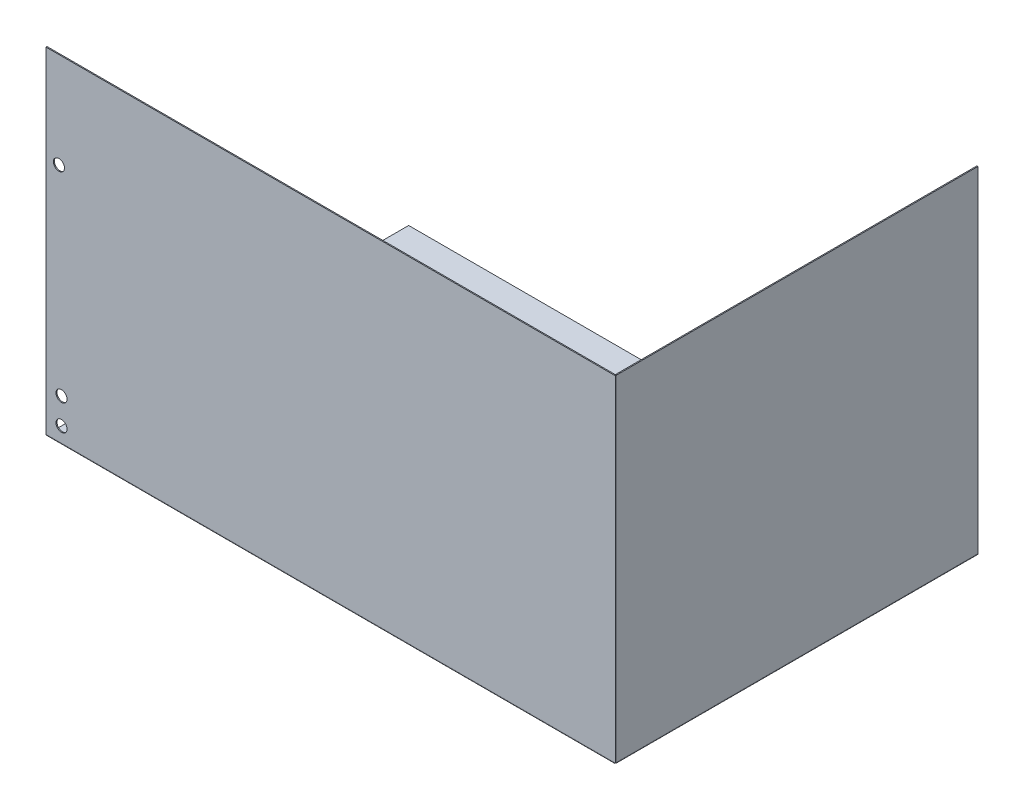
ISO-10303-21;
HEADER;
FILE_DESCRIPTION(('STEP AP214'),'2;1');
FILE_NAME('part.step','',(''),(''),'','','');
FILE_SCHEMA(('AUTOMOTIVE_DESIGN { 1 0 10303 214 1 1 1 1 }'));
ENDSEC;
DATA;
#1=APPLICATION_CONTEXT('core data for automotive mechanical design processes');
#2=APPLICATION_PROTOCOL_DEFINITION('international standard','automotive_design',2000,#1);
#3=PRODUCT_CONTEXT('',#1,'mechanical');
#4=PRODUCT('Part','Part','',(#3));
#5=PRODUCT_RELATED_PRODUCT_CATEGORY('part','',(#4));
#6=PRODUCT_DEFINITION_FORMATION('','',#4);
#7=PRODUCT_DEFINITION_CONTEXT('part definition',#1,'design');
#8=PRODUCT_DEFINITION('design','',#6,#7);
#9=PRODUCT_DEFINITION_SHAPE('','',#8);
#10=(LENGTH_UNIT() NAMED_UNIT(*) SI_UNIT(.MILLI.,.METRE.));
#11=(NAMED_UNIT(*) PLANE_ANGLE_UNIT() SI_UNIT($,.RADIAN.));
#12=(NAMED_UNIT(*) SI_UNIT($,.STERADIAN.) SOLID_ANGLE_UNIT());
#13=UNCERTAINTY_MEASURE_WITH_UNIT(LENGTH_MEASURE(1.E-05),#10,'distance_accuracy_value','');
#14=(GEOMETRIC_REPRESENTATION_CONTEXT(3) GLOBAL_UNCERTAINTY_ASSIGNED_CONTEXT((#13)) GLOBAL_UNIT_ASSIGNED_CONTEXT((#10,
#11,#12)) REPRESENTATION_CONTEXT('',''));
#15=CARTESIAN_POINT('',(0.,0.,0.));
#16=DIRECTION('',(0.,0.,1.));
#17=DIRECTION('',(1.,0.,0.));
#18=AXIS2_PLACEMENT_3D('',#15,#16,#17);
#19=CARTESIAN_POINT('',(0.,-2.00000000000001,-699.));
#20=DIRECTION('',(0.,0.,-1.));
#21=DIRECTION('',(-1.,0.,0.));
#22=AXIS2_PLACEMENT_3D('',#19,#20,#21);
#23=PLANE('',#22);
#24=DIRECTION('',(-1.,0.,0.));
#25=VECTOR('',#24,1.);
#26=CARTESIAN_POINT('',(0.,0.,-699.));
#27=LINE('',#26,#25);
#28=CARTESIAN_POINT('',(1099.,0.,-699.));
#29=VERTEX_POINT('',#28);
#30=CARTESIAN_POINT('',(0.,0.,-699.));
#31=VERTEX_POINT('',#30);
#32=EDGE_CURVE('E127',#29,#31,#27,.T.);
#33=ORIENTED_EDGE('',*,*,#32,.F.);
#34=DIRECTION('',(0.,-1.,0.));
#35=VECTOR('',#34,1.);
#36=CARTESIAN_POINT('',(1099.,0.,-699.));
#37=LINE('',#36,#35);
#38=CARTESIAN_POINT('',(1099.,-2.00000000000001,-699.));
#39=VERTEX_POINT('',#38);
#40=EDGE_CURVE('E842',#29,#39,#37,.T.);
#41=ORIENTED_EDGE('',*,*,#40,.T.);
#42=DIRECTION('',(-1.,0.,0.));
#43=VECTOR('',#42,1.);
#44=CARTESIAN_POINT('',(0.,-2.00000000000001,-699.));
#45=LINE('',#44,#43);
#46=CARTESIAN_POINT('',(0.,-2.00000000000001,-699.));
#47=VERTEX_POINT('',#46);
#48=EDGE_CURVE('E885',#39,#47,#45,.T.);
#49=ORIENTED_EDGE('',*,*,#48,.T.);
#50=DIRECTION('',(0.,1.,0.));
#51=VECTOR('',#50,1.);
#52=CARTESIAN_POINT('',(0.,-2.00000000000001,-699.));
#53=LINE('',#52,#51);
#54=EDGE_CURVE('E888',#47,#31,#53,.T.);
#55=ORIENTED_EDGE('',*,*,#54,.T.);
#56=EDGE_LOOP('',(#33,#41,#49,#55));
#57=FACE_BOUND('',#56,.T.);
#58=ADVANCED_FACE('F100',(#57),#23,.T.);
#59=CARTESIAN_POINT('',(0.,-2.00000000000001,0.));
#60=DIRECTION('',(0.,-1.,0.));
#61=DIRECTION('',(0.,0.,-1.));
#62=AXIS2_PLACEMENT_3D('',#59,#60,#61);
#63=PLANE('',#62);
#64=CARTESIAN_POINT('',(28.,-2.,-349.5));
#65=DIRECTION('',(0.,1.,0.));
#66=DIRECTION('',(0.,0.,1.));
#67=AXIS2_PLACEMENT_3D('',#64,#65,#66);
#68=CIRCLE('',#67,13.5);
#69=CARTESIAN_POINT('',(28.,-2.,-336.));
#70=VERTEX_POINT('',#69);
#71=EDGE_CURVE('E811',#70,#70,#68,.T.);
#72=ORIENTED_EDGE('',*,*,#71,.T.);
#73=EDGE_LOOP('',(#72));
#74=FACE_BOUND('',#73,.T.);
#75=CARTESIAN_POINT('',(1071.,-2.,-349.5));
#76=DIRECTION('',(0.,1.,0.));
#77=DIRECTION('',(0.,0.,-1.));
#78=AXIS2_PLACEMENT_3D('',#75,#76,#77);
#79=CIRCLE('',#78,13.5000000000001);
#80=CARTESIAN_POINT('',(1071.,-2.,-363.));
#81=VERTEX_POINT('',#80);
#82=EDGE_CURVE('E820',#81,#81,#79,.T.);
#83=ORIENTED_EDGE('',*,*,#82,.T.);
#84=EDGE_LOOP('',(#83));
#85=FACE_BOUND('',#84,.T.);
#86=ORIENTED_EDGE('',*,*,#48,.F.);
#87=DIRECTION('',(0.,0.,1.));
#88=VECTOR('',#87,1.);
#89=CARTESIAN_POINT('',(1099.,-2.00000000000001,-699.));
#90=LINE('',#89,#88);
#91=CARTESIAN_POINT('',(1099.,-2.00000000000001,0.));
#92=VERTEX_POINT('',#91);
#93=EDGE_CURVE('E839',#39,#92,#90,.T.);
#94=ORIENTED_EDGE('',*,*,#93,.T.);
#95=DIRECTION('',(1.,0.,0.));
#96=VECTOR('',#95,1.);
#97=CARTESIAN_POINT('',(0.,-2.00000000000001,0.));
#98=LINE('',#97,#96);
#99=CARTESIAN_POINT('',(0.,-2.00000000000001,0.));
#100=VERTEX_POINT('',#99);
#101=EDGE_CURVE('E894',#100,#92,#98,.T.);
#102=ORIENTED_EDGE('',*,*,#101,.F.);
#103=DIRECTION('',(0.,0.,1.));
#104=VECTOR('',#103,1.);
#105=CARTESIAN_POINT('',(0.,-2.00000000000001,0.));
#106=LINE('',#105,#104);
#107=EDGE_CURVE('E881',#47,#100,#106,.T.);
#108=ORIENTED_EDGE('',*,*,#107,.F.);
#109=EDGE_LOOP('',(#86,#94,#102,#108));
#110=FACE_BOUND('',#109,.T.);
#111=ADVANCED_FACE('F451',(#74,#85,#110),#63,.T.);
#112=CARTESIAN_POINT('',(0.,0.,0.));
#113=DIRECTION('',(0.,-1.,0.));
#114=DIRECTION('',(0.,0.,-1.));
#115=AXIS2_PLACEMENT_3D('',#112,#113,#114);
#116=PLANE('',#115);
#117=CARTESIAN_POINT('',(28.,0.,-349.5));
#118=DIRECTION('',(0.,1.,0.));
#119=DIRECTION('',(0.,0.,1.));
#120=AXIS2_PLACEMENT_3D('',#117,#118,#119);
#121=CIRCLE('',#120,13.5);
#122=CARTESIAN_POINT('',(28.,0.,-336.));
#123=VERTEX_POINT('',#122);
#124=EDGE_CURVE('E816',#123,#123,#121,.T.);
#125=ORIENTED_EDGE('',*,*,#124,.F.);
#126=EDGE_LOOP('',(#125));
#127=FACE_BOUND('',#126,.T.);
#128=CARTESIAN_POINT('',(1071.,0.,-349.5));
#129=DIRECTION('',(0.,1.,0.));
#130=DIRECTION('',(0.,0.,-1.));
#131=AXIS2_PLACEMENT_3D('',#128,#129,#130);
#132=CIRCLE('',#131,13.5000000000001);
#133=CARTESIAN_POINT('',(1071.,0.,-363.));
#134=VERTEX_POINT('',#133);
#135=EDGE_CURVE('E794',#134,#134,#132,.T.);
#136=ORIENTED_EDGE('',*,*,#135,.F.);
#137=EDGE_LOOP('',(#136));
#138=FACE_BOUND('',#137,.T.);
#139=DIRECTION('',(0.,0.,1.));
#140=VECTOR('',#139,1.);
#141=CARTESIAN_POINT('',(1099.,0.,-699.));
#142=LINE('',#141,#140);
#143=CARTESIAN_POINT('',(1099.,0.,0.));
#144=VERTEX_POINT('',#143);
#145=EDGE_CURVE('E112',#29,#144,#142,.T.);
#146=ORIENTED_EDGE('',*,*,#145,.F.);
#147=ORIENTED_EDGE('',*,*,#32,.T.);
#148=DIRECTION('',(0.,0.,1.));
#149=VECTOR('',#148,1.);
#150=CARTESIAN_POINT('',(0.,0.,0.));
#151=LINE('',#150,#149);
#152=CARTESIAN_POINT('',(0.,0.,0.));
#153=VERTEX_POINT('',#152);
#154=EDGE_CURVE('E388',#31,#153,#151,.T.);
#155=ORIENTED_EDGE('',*,*,#154,.T.);
#156=DIRECTION('',(1.,0.,0.));
#157=VECTOR('',#156,1.);
#158=CARTESIAN_POINT('',(0.,0.,0.));
#159=LINE('',#158,#157);
#160=EDGE_CURVE('E119',#153,#144,#159,.T.);
#161=ORIENTED_EDGE('',*,*,#160,.T.);
#162=EDGE_LOOP('',(#146,#147,#155,#161));
#163=FACE_BOUND('',#162,.T.);
#164=ADVANCED_FACE('F454',(#127,#138,#163),#116,.F.);
#165=CARTESIAN_POINT('',(0.,-2.00000000000001,0.));
#166=DIRECTION('',(-1.,0.,0.));
#167=DIRECTION('',(0.,0.,1.));
#168=AXIS2_PLACEMENT_3D('',#165,#166,#167);
#169=PLANE('',#168);
#170=ORIENTED_EDGE('',*,*,#154,.F.);
#171=ORIENTED_EDGE('',*,*,#54,.F.);
#172=ORIENTED_EDGE('',*,*,#107,.T.);
#173=DIRECTION('',(0.,1.,0.));
#174=VECTOR('',#173,1.);
#175=CARTESIAN_POINT('',(0.,-2.00000000000001,0.));
#176=LINE('',#175,#174);
#177=EDGE_CURVE('E843',#100,#153,#176,.T.);
#178=ORIENTED_EDGE('',*,*,#177,.T.);
#179=EDGE_LOOP('',(#170,#171,#172,#178));
#180=FACE_BOUND('',#179,.T.);
#181=ADVANCED_FACE('F102',(#180),#169,.T.);
#182=CARTESIAN_POINT('',(0.,650.,3.));
#183=DIRECTION('',(0.,-1.,0.));
#184=DIRECTION('',(0.,0.,-1.));
#185=AXIS2_PLACEMENT_3D('',#182,#183,#184);
#186=PLANE('',#185);
#187=DIRECTION('',(1.,0.,0.));
#188=VECTOR('',#187,1.);
#189=CARTESIAN_POINT('',(0.,650.,0.999999999999997));
#190=LINE('',#189,#188);
#191=CARTESIAN_POINT('',(1102.,650.,0.999999999999997));
#192=VERTEX_POINT('',#191);
#193=CARTESIAN_POINT('',(0.,650.,0.999999999999997));
#194=VERTEX_POINT('',#193);
#195=EDGE_CURVE('E410',#192,#194,#190,.F.);
#196=ORIENTED_EDGE('',*,*,#195,.T.);
#197=DIRECTION('',(0.,0.,-1.));
#198=VECTOR('',#197,1.);
#199=CARTESIAN_POINT('',(0.,650.,3.));
#200=LINE('',#199,#198);
#201=CARTESIAN_POINT('',(0.,650.,3.));
#202=VERTEX_POINT('',#201);
#203=EDGE_CURVE('E389',#202,#194,#200,.T.);
#204=ORIENTED_EDGE('',*,*,#203,.F.);
#205=DIRECTION('',(-1.,0.,0.));
#206=VECTOR('',#205,1.);
#207=CARTESIAN_POINT('',(0.,650.,3.));
#208=LINE('',#207,#206);
#209=CARTESIAN_POINT('',(1102.,650.,3.));
#210=VERTEX_POINT('',#209);
#211=EDGE_CURVE('E402',#210,#202,#208,.T.);
#212=ORIENTED_EDGE('',*,*,#211,.F.);
#213=DIRECTION('',(0.,0.,-1.));
#214=VECTOR('',#213,1.);
#215=CARTESIAN_POINT('',(1102.,650.,3.));
#216=LINE('',#215,#214);
#217=EDGE_CURVE('E406',#210,#192,#216,.T.);
#218=ORIENTED_EDGE('',*,*,#217,.T.);
#219=EDGE_LOOP('',(#196,#204,#212,#218));
#220=FACE_BOUND('',#219,.T.);
#221=ADVANCED_FACE('F357',(#220),#186,.F.);
#222=CARTESIAN_POINT('',(0.,0.,3.));
#223=DIRECTION('',(0.,0.,-1.));
#224=DIRECTION('',(-1.,0.,0.));
#225=AXIS2_PLACEMENT_3D('',#222,#223,#224);
#226=PLANE('',#225);
#227=CARTESIAN_POINT('',(30.0000000000012,29.9999999999999,3.));
#228=DIRECTION('',(0.,0.,1.));
#229=DIRECTION('',(1.,0.,0.));
#230=AXIS2_PLACEMENT_3D('',#227,#228,#229);
#231=CIRCLE('',#230,10.75);
#232=CARTESIAN_POINT('',(40.7500000000012,29.9999999999999,3.));
#233=VERTEX_POINT('',#232);
#234=EDGE_CURVE('E787',#233,#233,#231,.T.);
#235=ORIENTED_EDGE('',*,*,#234,.F.);
#236=EDGE_LOOP('',(#235));
#237=FACE_BOUND('',#236,.T.);
#238=CARTESIAN_POINT('',(30.0000000000012,79.9999999999999,3.));
#239=DIRECTION('',(0.,0.,1.));
#240=DIRECTION('',(1.,0.,0.));
#241=AXIS2_PLACEMENT_3D('',#238,#239,#240);
#242=CIRCLE('',#241,10.75);
#243=CARTESIAN_POINT('',(40.7500000000012,79.9999999999999,3.));
#244=VERTEX_POINT('',#243);
#245=EDGE_CURVE('E797',#244,#244,#242,.T.);
#246=ORIENTED_EDGE('',*,*,#245,.F.);
#247=EDGE_LOOP('',(#246));
#248=FACE_BOUND('',#247,.T.);
#249=CARTESIAN_POINT('',(25.,465.,3.));
#250=DIRECTION('',(0.,0.,1.));
#251=DIRECTION('',(1.,0.,0.));
#252=AXIS2_PLACEMENT_3D('',#249,#250,#251);
#253=CIRCLE('',#252,10.75);
#254=CARTESIAN_POINT('',(35.75,465.,3.));
#255=VERTEX_POINT('',#254);
#256=EDGE_CURVE('E807',#255,#255,#253,.T.);
#257=ORIENTED_EDGE('',*,*,#256,.F.);
#258=EDGE_LOOP('',(#257));
#259=FACE_BOUND('',#258,.T.);
#260=DIRECTION('',(-1.,0.,0.));
#261=VECTOR('',#260,1.);
#262=CARTESIAN_POINT('',(0.,0.999999999999997,3.));
#263=LINE('',#262,#261);
#264=CARTESIAN_POINT('',(1102.,0.999999999999998,3.));
#265=VERTEX_POINT('',#264);
#266=CARTESIAN_POINT('',(0.,1.,3.));
#267=VERTEX_POINT('',#266);
#268=EDGE_CURVE('E417',#265,#267,#263,.T.);
#269=ORIENTED_EDGE('',*,*,#268,.F.);
#270=DIRECTION('',(0.,1.,0.));
#271=VECTOR('',#270,1.);
#272=CARTESIAN_POINT('',(1102.,0.999999999999998,3.));
#273=LINE('',#272,#271);
#274=EDGE_CURVE('E405',#265,#210,#273,.T.);
#275=ORIENTED_EDGE('',*,*,#274,.T.);
#276=ORIENTED_EDGE('',*,*,#211,.T.);
#277=DIRECTION('',(0.,-1.,0.));
#278=VECTOR('',#277,1.);
#279=CARTESIAN_POINT('',(0.,0.,3.));
#280=LINE('',#279,#278);
#281=EDGE_CURVE('E397',#202,#267,#280,.T.);
#282=ORIENTED_EDGE('',*,*,#281,.T.);
#283=EDGE_LOOP('',(#269,#275,#276,#282));
#284=FACE_BOUND('',#283,.T.);
#285=ADVANCED_FACE('F443',(#237,#248,#259,#284),#226,.F.);
#286=CARTESIAN_POINT('',(1102.,0.999999999999998,3.));
#287=DIRECTION('',(-1.,0.,0.));
#288=DIRECTION('',(0.,-1.,0.));
#289=AXIS2_PLACEMENT_3D('',#286,#287,#288);
#290=PLANE('',#289);
#291=DIRECTION('',(0.,1.,0.));
#292=VECTOR('',#291,1.);
#293=CARTESIAN_POINT('',(1102.,0.999999999999998,0.999999999999998));
#294=LINE('',#293,#292);
#295=CARTESIAN_POINT('',(1102.,0.999999999999998,0.999999999999998));
#296=VERTEX_POINT('',#295);
#297=EDGE_CURVE('E401',#296,#192,#294,.T.);
#298=ORIENTED_EDGE('',*,*,#297,.T.);
#299=ORIENTED_EDGE('',*,*,#217,.F.);
#300=ORIENTED_EDGE('',*,*,#274,.F.);
#301=CARTESIAN_POINT('',(1102.,0.999999999999999,0.979999999999997));
#302=CARTESIAN_POINT('',(1102.,0.999999999999999,0.999999999999997));
#303=CARTESIAN_POINT('',(1102.,0.999999999999998,3.));
#304=CARTESIAN_POINT('',(1102.,0.999999999999998,3.0202));
#305=B_SPLINE_CURVE_WITH_KNOTS('',1,(#301,#302,#303,#304),.UNSPECIFIED.,.F.,.F.,(2,1,1,2),
(-0.0101,-9.9999999999989E-05,0.9999,1.01),.UNSPECIFIED.);
#306=EDGE_CURVE('E335',#265,#296,#305,.F.);
#307=ORIENTED_EDGE('',*,*,#306,.T.);
#308=EDGE_LOOP('',(#298,#299,#300,#307));
#309=FACE_BOUND('',#308,.T.);
#310=ADVANCED_FACE('F433',(#309),#290,.F.);
#311=CARTESIAN_POINT('',(0.,0.,0.999999999999997));
#312=DIRECTION('',(0.,0.,-1.));
#313=DIRECTION('',(-1.,0.,0.));
#314=AXIS2_PLACEMENT_3D('',#311,#312,#313);
#315=PLANE('',#314);
#316=CARTESIAN_POINT('',(30.0000000000012,29.9999999999999,0.999999999999997));
#317=DIRECTION('',(0.,0.,1.));
#318=DIRECTION('',(1.,0.,0.));
#319=AXIS2_PLACEMENT_3D('',#316,#317,#318);
#320=CIRCLE('',#319,10.75);
#321=CARTESIAN_POINT('',(40.7500000000012,29.9999999999999,0.999999999999997));
#322=VERTEX_POINT('',#321);
#323=EDGE_CURVE('E784',#322,#322,#320,.T.);
#324=ORIENTED_EDGE('',*,*,#323,.T.);
#325=EDGE_LOOP('',(#324));
#326=FACE_BOUND('',#325,.T.);
#327=CARTESIAN_POINT('',(30.0000000000012,79.9999999999999,0.999999999999997));
#328=DIRECTION('',(0.,0.,1.));
#329=DIRECTION('',(1.,0.,0.));
#330=AXIS2_PLACEMENT_3D('',#327,#328,#329);
#331=CIRCLE('',#330,10.75);
#332=CARTESIAN_POINT('',(40.7500000000012,79.9999999999999,0.999999999999997));
#333=VERTEX_POINT('',#332);
#334=EDGE_CURVE('E789',#333,#333,#331,.T.);
#335=ORIENTED_EDGE('',*,*,#334,.T.);
#336=EDGE_LOOP('',(#335));
#337=FACE_BOUND('',#336,.T.);
#338=CARTESIAN_POINT('',(25.,465.,0.999999999999997));
#339=DIRECTION('',(0.,0.,1.));
#340=DIRECTION('',(1.,0.,0.));
#341=AXIS2_PLACEMENT_3D('',#338,#339,#340);
#342=CIRCLE('',#341,10.75);
#343=CARTESIAN_POINT('',(35.75,465.,0.999999999999997));
#344=VERTEX_POINT('',#343);
#345=EDGE_CURVE('E803',#344,#344,#342,.T.);
#346=ORIENTED_EDGE('',*,*,#345,.T.);
#347=EDGE_LOOP('',(#346));
#348=FACE_BOUND('',#347,.T.);
#349=ORIENTED_EDGE('',*,*,#195,.F.);
#350=ORIENTED_EDGE('',*,*,#297,.F.);
#351=DIRECTION('',(1.,0.,0.));
#352=VECTOR('',#351,1.);
#353=CARTESIAN_POINT('',(0.,0.999999999999997,1.));
#354=LINE('',#353,#352);
#355=CARTESIAN_POINT('',(0.,0.999999999999997,0.999999999999997));
#356=VERTEX_POINT('',#355);
#357=EDGE_CURVE('E413',#356,#296,#354,.T.);
#358=ORIENTED_EDGE('',*,*,#357,.F.);
#359=DIRECTION('',(0.,1.,0.));
#360=VECTOR('',#359,1.);
#361=CARTESIAN_POINT('',(0.,0.,0.999999999999997));
#362=LINE('',#361,#360);
#363=EDGE_CURVE('E379',#194,#356,#362,.F.);
#364=ORIENTED_EDGE('',*,*,#363,.F.);
#365=EDGE_LOOP('',(#349,#350,#358,#364));
#366=FACE_BOUND('',#365,.T.);
#367=ADVANCED_FACE('F442',(#326,#337,#348,#366),#315,.T.);
#368=CARTESIAN_POINT('',(0.,0.,3.));
#369=DIRECTION('',(1.,0.,0.));
#370=DIRECTION('',(0.,1.,0.));
#371=AXIS2_PLACEMENT_3D('',#368,#369,#370);
#372=PLANE('',#371);
#373=DIRECTION('',(0.,0.,1.));
#374=VECTOR('',#373,1.);
#375=CARTESIAN_POINT('',(0.,0.999999999999997,3.));
#376=LINE('',#375,#374);
#377=EDGE_CURVE('E393',#356,#267,#376,.T.);
#378=ORIENTED_EDGE('',*,*,#377,.T.);
#379=ORIENTED_EDGE('',*,*,#281,.F.);
#380=ORIENTED_EDGE('',*,*,#203,.T.);
#381=ORIENTED_EDGE('',*,*,#363,.T.);
#382=EDGE_LOOP('',(#378,#379,#380,#381));
#383=FACE_BOUND('',#382,.T.);
#384=ADVANCED_FACE('F446',(#383),#372,.F.);
#385=CARTESIAN_POINT('',(0.,0.999999999999997,0.));
#386=DIRECTION('',(-1.,0.,0.));
#387=DIRECTION('',(0.,-1.,0.));
#388=AXIS2_PLACEMENT_3D('',#385,#386,#387);
#389=PLANE('',#388);
#390=ORIENTED_EDGE('',*,*,#377,.F.);
#391=CARTESIAN_POINT('',(0.,0.999999999999997,0.));
#392=DIRECTION('',(1.,0.,0.));
#393=DIRECTION('',(0.,1.,0.));
#394=AXIS2_PLACEMENT_3D('',#391,#392,#393);
#395=CIRCLE('',#394,1.);
#396=EDGE_CURVE('E234',#356,#153,#395,.T.);
#397=ORIENTED_EDGE('',*,*,#396,.T.);
#398=ORIENTED_EDGE('',*,*,#177,.F.);
#399=CARTESIAN_POINT('',(0.,0.999999999999997,0.));
#400=DIRECTION('',(1.,0.,0.));
#401=DIRECTION('',(0.,1.,0.));
#402=AXIS2_PLACEMENT_3D('',#399,#400,#401);
#403=CIRCLE('',#402,3.);
#404=EDGE_CURVE('E318',#267,#100,#403,.T.);
#405=ORIENTED_EDGE('',*,*,#404,.F.);
#406=EDGE_LOOP('',(#390,#397,#398,#405));
#407=FACE_BOUND('',#406,.T.);
#408=ADVANCED_FACE('F355',(#407),#389,.T.);
#409=CARTESIAN_POINT('',(1099.,-2.0202,0.));
#410=CARTESIAN_POINT('',(1099.25003230087,-2.0202,0.395394096176923));
#411=CARTESIAN_POINT('',(1099.5,-1.94159227807365,0.790530960341883));
#412=CARTESIAN_POINT('',(1100.,-1.63900965010753,1.52103004451618));
#413=CARTESIAN_POINT('',(1100.25,-1.41515379741099,1.85605400366823));
#414=CARTESIAN_POINT('',(1100.75,-0.856054003668244,2.41515379741098));
#415=CARTESIAN_POINT('',(1101.,-0.521030044516195,2.63900965010752));
#416=CARTESIAN_POINT('',(1101.5,0.209469039658099,2.94159227807364));
#417=CARTESIAN_POINT('',(1101.74996769913,0.604605903822849,3.0202));
#418=CARTESIAN_POINT('',(1102.,0.999999999999998,3.0202));
#419=CARTESIAN_POINT('',(1099.,-2.,0.));
#420=CARTESIAN_POINT('',(1099.25003207487,-2.,0.392749464779994));
#421=CARTESIAN_POINT('',(1099.5,-1.92191803000495,0.785243653077826));
#422=CARTESIAN_POINT('',(1100.,-1.62135916506278,1.51085694111269));
#423=CARTESIAN_POINT('',(1100.25,-1.39900052719455,1.84364015992473));
#424=CARTESIAN_POINT('',(1100.75,-0.84364015992475,2.39900052719453));
#425=CARTESIAN_POINT('',(1101.,-0.510856941112703,2.62135916506277));
#426=CARTESIAN_POINT('',(1101.5,0.214756346922156,2.92191803000494));
#427=CARTESIAN_POINT('',(1101.74996792513,0.607250535219783,3.));
#428=CARTESIAN_POINT('',(1102.,0.999999999999998,3.));
#429=CARTESIAN_POINT('',(1099.,0.,0.));
#430=CARTESIAN_POINT('',(1099.25000969849,0.,0.130904772014722));
#431=CARTESIAN_POINT('',(1099.5,0.0260273233316833,0.261747884359273));
#432=CARTESIAN_POINT('',(1100.,0.12621361164574,0.503618980370893));
#433=CARTESIAN_POINT('',(1100.25,0.200333157601818,0.614546719974909));
#434=CARTESIAN_POINT('',(1100.75,0.385453280025083,0.799666842398176));
#435=CARTESIAN_POINT('',(1101.,0.496381019629099,0.873786388354254));
#436=CARTESIAN_POINT('',(1101.5,0.738252115640719,0.973972676668312));
#437=CARTESIAN_POINT('',(1101.74999030152,0.869095227985495,0.999999999999997));
#438=CARTESIAN_POINT('',(1102.,0.999999999999999,0.999999999999997));
#439=CARTESIAN_POINT('',(1099.,0.02,0.));
#440=CARTESIAN_POINT('',(1099.25000947472,0.0199999999999994,0.128286325087069));
#441=CARTESIAN_POINT('',(1099.5,0.0455067768650496,0.256512926672087));
#442=CARTESIAN_POINT('',(1100.,0.143689339412826,0.493546600763475));
#443=CARTESIAN_POINT('',(1100.25,0.216326494449782,0.602255785575411));
#444=CARTESIAN_POINT('',(1100.75,0.397744214424582,0.783673505550212));
#445=CARTESIAN_POINT('',(1101.,0.506453399236517,0.856310660587168));
#446=CARTESIAN_POINT('',(1101.5,0.743487073327904,0.954493223134946));
#447=CARTESIAN_POINT('',(1101.74999052528,0.871713674913152,0.979999999999997));
#448=CARTESIAN_POINT('',(1102.,0.999999999999999,0.979999999999997));
#449=B_SPLINE_SURFACE_WITH_KNOTS('',1,3,((#409,#410,#411,#412,#413,#414,#415,#416,#417,#418),
(#419,#420,#421,#422,#423,#424,#425,#426,#427,#428),(#429,#430,#431,#432,#433,#434,#435,#436,
#437,#438),(#439,#440,#441,#442,#443,#444,#445,#446,#447,#448)),.UNSPECIFIED.,.F.,.F.,.F.,(2,1,
1,2),(4,2,2,2,4),(-0.0101,0.,1.,1.01),(0.,0.25,0.5,0.75,1.),.UNSPECIFIED.);
#450=CARTESIAN_POINT('',(1099.,0.,0.));
#451=CARTESIAN_POINT('',(1099.07758297631,-1.35262863544364E-05,0.0406197853139724));
#452=CARTESIAN_POINT('',(1099.15516416974,0.0024742902367196,0.0812400759629049));
#453=CARTESIAN_POINT('',(1099.31031167595,0.0123568558998606,0.16187435041746));
#454=CARTESIAN_POINT('',(1099.38787798892,0.0197507285039237,0.201888441223243));
#455=CARTESIAN_POINT('',(1099.54300788587,0.039349179897469,0.280715779874269));
#456=CARTESIAN_POINT('',(1099.62057146975,0.0515534952765008,0.319529093346248));
#457=CARTESIAN_POINT('',(1099.77561447662,0.0805713012979521,0.395343082071779));
#458=CARTESIAN_POINT('',(1099.85309389954,0.0973797728247778,0.432345679760071));
#459=CARTESIAN_POINT('',(1100.00804683273,0.135366018687105,0.504037021185813));
#460=CARTESIAN_POINT('',(1100.08552034302,0.156543485006057,0.538725927811746));
#461=CARTESIAN_POINT('',(1100.24045803578,0.202947697540182,0.605271808078152));
#462=CARTESIAN_POINT('',(1100.31792221852,0.228174160183442,0.637128979796901));
#463=CARTESIAN_POINT('',(1100.51184211453,0.295934453602944,0.712744337954237));
#464=CARTESIAN_POINT('',(1100.62830948943,0.340790965760712,0.754427578397558));
#465=CARTESIAN_POINT('',(1100.86124574618,0.43734786707701,0.828940757952194));
#466=CARTESIAN_POINT('',(1100.9777146265,0.489049080998571,0.8617696286922));
#467=CARTESIAN_POINT('',(1101.21031908588,0.597396117246771,0.917392434775064));
#468=CARTESIAN_POINT('',(1101.32645466272,0.654027331126905,0.940214884123563));
#469=CARTESIAN_POINT('',(1101.55866971091,0.770472991636494,0.975196331954173));
#470=CARTESIAN_POINT('',(1101.6747491719,0.830285424279342,0.987361993840571));
#471=CARTESIAN_POINT('',(1101.82566817447,0.908832181787753,0.996003712483796));
#472=CARTESIAN_POINT('',(1101.86054227122,0.927036998310889,0.997502067569785));
#473=CARTESIAN_POINT('',(1101.93027641632,0.963493876349861,0.999499813027675));
#474=CARTESIAN_POINT('',(1101.96513646464,0.981745915773803,0.99999960727779));
#475=CARTESIAN_POINT('',(1102.,0.999999999999999,0.999999999999997));
#476=B_SPLINE_CURVE_WITH_KNOTS('',3,(#450,#451,#452,#453,#454,#455,#456,#457,#458,#459,#460,
#461,#462,#463,#464,#465,#466,#467,#468,#469,#470,#471,#472,#473,#474,#475),.UNSPECIFIED.,.F.,
.F.,(4,2,2,2,2,2,2,2,2,2,2,2,4),(0.,0.262682688178855,0.525318457028982,0.787939846454881,
1.05027607677922,1.31259381857064,1.57489319691924,1.96914224884762,2.3634388497431,
2.75660445412652,3.14952404672899,3.26762030781198,3.38566879396845),.UNSPECIFIED.);
#477=EDGE_CURVE('E328',#144,#296,#476,.T.);
#478=CARTESIAN_POINT('',(1099.,-2.,0.));
#479=CARTESIAN_POINT('',(1099.06371995404,-2.00001804323973,0.100085328372402));
#480=CARTESIAN_POINT('',(1099.12743736619,-1.99499225990972,0.200169211821153));
#481=CARTESIAN_POINT('',(1099.25486538779,-1.97498248509441,0.399331870846817));
#482=CARTESIAN_POINT('',(1099.31857599742,-1.95999915873978,0.498410713108372));
#483=CARTESIAN_POINT('',(1099.44595622888,-1.9202165085825,0.694511622991503));
#484=CARTESIAN_POINT('',(1099.50962585073,-1.89542350440243,0.791534972496725));
#485=CARTESIAN_POINT('',(1099.63696739309,-1.83627622430222,0.982617845059217));
#486=CARTESIAN_POINT('',(1099.70063931354,-1.80192210933122,1.07667741797823));
#487=CARTESIAN_POINT('',(1099.82805074349,-1.72395290715002,1.26099349867861));
#488=CARTESIAN_POINT('',(1099.89179025343,-1.68032808835149,1.35124588975352));
#489=CARTESIAN_POINT('',(1100.01928861527,-1.58425657851386,1.52697374859294));
#490=CARTESIAN_POINT('',(1100.08304746547,-1.53180658957699,1.61244741461773));
#491=CARTESIAN_POINT('',(1100.21052301583,-1.41866203614672,1.7776647354657));
#492=CARTESIAN_POINT('',(1100.27423971507,-1.3579731193271,1.85741225872298));
#493=CARTESIAN_POINT('',(1100.40167585395,-1.228931798164,2.01044286755785));
#494=CARTESIAN_POINT('',(1100.46539529359,-1.16057939421794,2.08372595347071));
#495=CARTESIAN_POINT('',(1100.59285243559,-1.01687441623449,2.22311507707588));
#496=CARTESIAN_POINT('',(1100.65659013807,-0.941519888146488,2.28921910011099));
#497=CARTESIAN_POINT('',(1100.78403182069,-0.784614049253562,2.41353816376526));
#498=CARTESIAN_POINT('',(1100.84773580303,-0.703065561107698,2.47175676459463));
#499=CARTESIAN_POINT('',(1100.9751982336,-0.534492397778193,2.57979927987484));
#500=CARTESIAN_POINT('',(1101.03895668341,-0.447463261341788,2.62961623082905));
#501=CARTESIAN_POINT('',(1101.1664514281,-0.268895333650156,2.72028058926447));
#502=CARTESIAN_POINT('',(1101.23018772158,-0.177358370052333,2.76113159583963));
#503=CARTESIAN_POINT('',(1101.35276742935,0.00217274257146958,2.83070407953411));
#504=CARTESIAN_POINT('',(1101.41161118565,0.0899001489064813,2.860115555445));
#505=CARTESIAN_POINT('',(1101.5292925215,0.267694603462716,2.91071670710838));
#506=CARTESIAN_POINT('',(1101.58813010121,0.357761527512001,2.93190681826947));
#507=CARTESIAN_POINT('',(1101.7058018666,0.539458666225407,2.9658789272241));
#508=CARTESIAN_POINT('',(1101.76463605219,0.631088760553354,2.97866156927262));
#509=CARTESIAN_POINT('',(1101.88231296756,0.815145392328873,2.99572906001105));
#510=CARTESIAN_POINT('',(1101.94115569758,0.907572015521614,3.00001298205393));
#511=CARTESIAN_POINT('',(1102.,0.999999999999998,3.));
#512=B_SPLINE_CURVE_WITH_KNOTS('',3,(#478,#479,#480,#481,#482,#483,#484,#485,#486,#487,#488,
#489,#490,#491,#492,#493,#494,#495,#496,#497,#498,#499,#500,#501,#502,#503,#504,#505,#506,#507,
#508,#509,#510,#511),.UNSPECIFIED.,.F.,.F.,(4,2,2,2,2,2,2,2,2,2,2,2,2,2,2,2,4),(0.,
0.355833433178657,0.711643100259015,1.06722391872524,1.42279875180236,1.7787486969641,
2.13483195449243,2.49067234279279,2.84651271263864,3.20245268516821,3.55823141387559,
3.91430358692878,4.2702325636166,4.59886264616444,4.92747532188204,5.25606281344189,
5.58468613014833),.UNSPECIFIED.);
#513=EDGE_CURVE('E327',#92,#265,#512,.T.);
#514=CARTESIAN_POINT('',(1099.,0.,0.));
#515=CARTESIAN_POINT('',(1099.,-2.00000000000001,0.));
#516=B_SPLINE_CURVE_WITH_KNOTS('',1,(#514,#515),.UNSPECIFIED.,.F.,.F.,(2,2),(0.,1.),.UNSPECIFIED.);
#517=EDGE_CURVE('E13',#144,#92,#516,.T.);
#518=ORIENTED_EDGE('',*,*,#477,.T.);
#519=ORIENTED_EDGE('',*,*,#306,.F.);
#520=ORIENTED_EDGE('',*,*,#513,.F.);
#521=ORIENTED_EDGE('',*,*,#517,.F.);
#522=EDGE_LOOP('',(#518,#519,#520,#521));
#523=FACE_BOUND('',#522,.T.);
#524=ADVANCED_FACE('F342',(#523),#449,.T.);
#525=CARTESIAN_POINT('',(-551.005856299308,0.999999999999995,0.));
#526=DIRECTION('',(1.,0.,0.));
#527=DIRECTION('',(0.,1.,0.));
#528=AXIS2_PLACEMENT_3D('',#525,#526,#527);
#529=CYLINDRICAL_SURFACE('',#528,3.);
#530=ORIENTED_EDGE('',*,*,#101,.T.);
#531=ORIENTED_EDGE('',*,*,#513,.T.);
#532=ORIENTED_EDGE('',*,*,#268,.T.);
#533=ORIENTED_EDGE('',*,*,#404,.T.);
#534=EDGE_LOOP('',(#530,#531,#532,#533));
#535=FACE_BOUND('',#534,.T.);
#536=ADVANCED_FACE('F354',(#535),#529,.T.);
#537=CARTESIAN_POINT('',(-551.005856299308,0.999999999999995,0.));
#538=DIRECTION('',(1.,0.,0.));
#539=DIRECTION('',(0.,1.,0.));
#540=AXIS2_PLACEMENT_3D('',#537,#538,#539);
#541=CYLINDRICAL_SURFACE('',#540,1.);
#542=ORIENTED_EDGE('',*,*,#160,.F.);
#543=ORIENTED_EDGE('',*,*,#396,.F.);
#544=ORIENTED_EDGE('',*,*,#357,.T.);
#545=ORIENTED_EDGE('',*,*,#477,.F.);
#546=EDGE_LOOP('',(#542,#543,#544,#545));
#547=FACE_BOUND('',#546,.T.);
#548=ADVANCED_FACE('F515',(#547),#541,.F.);
#549=CARTESIAN_POINT('',(1102.,0.999999999999994,0.499999999999945));
#550=CARTESIAN_POINT('',(1102.,0.607230903941451,0.458325904578981));
#551=CARTESIAN_POINT('',(1101.92191803001,0.214756346922152,0.416666666666682));
#552=CARTESIAN_POINT('',(1101.62135916506,-0.510856941112705,0.333333333333346));
#553=CARTESIAN_POINT('',(1101.39900052719,-0.843640159924751,0.291666666666727));
#554=CARTESIAN_POINT('',(1100.84364015993,-1.39900052719455,0.20833333333344));
#555=CARTESIAN_POINT('',(1100.51085694111,-1.62135916506278,0.166666666666599));
#556=CARTESIAN_POINT('',(1099.78524365308,-1.92191803000495,0.0833333333332625));
#557=CARTESIAN_POINT('',(1099.39276909606,-2.00000000000001,0.0416740954209242));
#558=CARTESIAN_POINT('',(1099.,-2.00000000000001,0.));
#559=CARTESIAN_POINT('',(1100.,0.999999999999994,0.499999999999945));
#560=CARTESIAN_POINT('',(1100.,0.86907887651317,0.458326512083801));
#561=CARTESIAN_POINT('',(1099.97397267667,0.73825211564072,0.416666666666682));
#562=CARTESIAN_POINT('',(1099.87378638835,0.496381019629106,0.333333333333346));
#563=CARTESIAN_POINT('',(1099.7996668424,0.385453280025054,0.291666666666727));
#564=CARTESIAN_POINT('',(1099.61454671998,0.200333157601789,0.20833333333344));
#565=CARTESIAN_POINT('',(1099.50361898037,0.126213611645726,0.166666666666599));
#566=CARTESIAN_POINT('',(1099.26174788436,0.026027323331673,0.0833333333332625));
#567=CARTESIAN_POINT('',(1099.13092112349,0.,0.0416734879162928));
#568=CARTESIAN_POINT('',(1099.,0.,0.));
#569=B_SPLINE_SURFACE_WITH_KNOTS('',1,3,((#549,#550,#551,#552,#553,#554,#555,#556,#557,#558),
(#559,#560,#561,#562,#563,#564,#565,#566,#567,#568)),.UNSPECIFIED.,.F.,.F.,.F.,(2,2),(4,2,2,2,
4),(0.,1.),(0.,0.25,0.5,0.75,1.),.UNSPECIFIED.);
#570=CARTESIAN_POINT('',(1102.,0.999999999999994,0.499999999999945));
#571=CARTESIAN_POINT('',(1100.,0.999999999999994,0.499999999999945));
#572=B_SPLINE_CURVE_WITH_KNOTS('',1,(#570,#571),.UNSPECIFIED.,.F.,.F.,(2,2),(0.,1.),.UNSPECIFIED.);
#573=CARTESIAN_POINT('',(1100.,1.00000000000011,0.500000000000006));
#574=VERTEX_POINT('',#573);
#575=CARTESIAN_POINT('',(1102.,0.999999999999986,0.499999999999945));
#576=VERTEX_POINT('',#575);
#577=EDGE_CURVE('E314',#574,#576,#572,.F.);
#578=CARTESIAN_POINT('',(1100.,0.999999999999994,0.499999999999945));
#579=CARTESIAN_POINT('',(1100.,0.86907887651317,0.458326512083801));
#580=CARTESIAN_POINT('',(1099.97397267667,0.73825211564072,0.416666666666682));
#581=CARTESIAN_POINT('',(1099.87378638835,0.496381019629106,0.333333333333346));
#582=CARTESIAN_POINT('',(1099.7996668424,0.385453280025054,0.291666666666727));
#583=CARTESIAN_POINT('',(1099.61454671998,0.200333157601789,0.20833333333344));
#584=CARTESIAN_POINT('',(1099.50361898037,0.126213611645726,0.166666666666599));
#585=CARTESIAN_POINT('',(1099.26174788436,0.026027323331673,0.0833333333332625));
#586=CARTESIAN_POINT('',(1099.13092112349,0.,0.0416734879162928));
#587=CARTESIAN_POINT('',(1099.,0.,0.));
#588=B_SPLINE_CURVE_WITH_KNOTS('',3,(#578,#579,#580,#581,#582,#583,#584,#585,#586,#587),
.UNSPECIFIED.,.F.,.F.,(4,2,2,2,4),(0.,0.25,0.5,0.75,1.),.UNSPECIFIED.);
#589=EDGE_CURVE('E240',#574,#144,#588,.T.);
#590=CARTESIAN_POINT('',(1099.,-2.00000000000001,0.));
#591=CARTESIAN_POINT('',(1099.39276909606,-2.00000000000001,0.0416740954209242));
#592=CARTESIAN_POINT('',(1099.78524365308,-1.92191803000495,0.0833333333332625));
#593=CARTESIAN_POINT('',(1100.51085694111,-1.62135916506278,0.166666666666599));
#594=CARTESIAN_POINT('',(1100.84364015993,-1.39900052719455,0.20833333333344));
#595=CARTESIAN_POINT('',(1101.39900052719,-0.843640159924751,0.291666666666727));
#596=CARTESIAN_POINT('',(1101.62135916506,-0.510856941112705,0.333333333333346));
#597=CARTESIAN_POINT('',(1101.92191803001,0.214756346922152,0.416666666666682));
#598=CARTESIAN_POINT('',(1102.,0.607230903941451,0.458325904578981));
#599=CARTESIAN_POINT('',(1102.,0.999999999999994,0.499999999999945));
#600=B_SPLINE_CURVE_WITH_KNOTS('',3,(#590,#591,#592,#593,#594,#595,#596,#597,#598,#599),
.UNSPECIFIED.,.F.,.F.,(4,2,2,2,4),(0.,0.25,0.5,0.75,1.),.UNSPECIFIED.);
#601=EDGE_CURVE('E235',#576,#92,#600,.F.);
#602=ORIENTED_EDGE('',*,*,#577,.F.);
#603=ORIENTED_EDGE('',*,*,#589,.T.);
#604=ORIENTED_EDGE('',*,*,#517,.T.);
#605=ORIENTED_EDGE('',*,*,#601,.F.);
#606=EDGE_LOOP('',(#602,#603,#604,#605));
#607=FACE_BOUND('',#606,.T.);
#608=ADVANCED_FACE('F266',(#607),#569,.T.);
#609=CARTESIAN_POINT('',(1099.,0.999999999999994,-699.));
#610=DIRECTION('',(0.,0.,-1.));
#611=DIRECTION('',(-1.,0.,0.));
#612=AXIS2_PLACEMENT_3D('',#609,#610,#611);
#613=PLANE('',#612);
#614=CARTESIAN_POINT('',(1099.,0.999999999999994,-699.));
#615=DIRECTION('',(0.,0.,1.));
#616=DIRECTION('',(1.,0.,0.));
#617=AXIS2_PLACEMENT_3D('',#614,#615,#616);
#618=CIRCLE('',#617,1.);
#619=CARTESIAN_POINT('',(1100.,1.00000000000011,-699.));
#620=VERTEX_POINT('',#619);
#621=EDGE_CURVE('E236',#29,#620,#618,.T.);
#622=ORIENTED_EDGE('',*,*,#621,.T.);
#623=DIRECTION('',(1.,0.,0.));
#624=VECTOR('',#623,1.);
#625=CARTESIAN_POINT('',(1100.,1.00000000000011,-699.));
#626=LINE('',#625,#624);
#627=CARTESIAN_POINT('',(1102.,1.00000000000011,-699.));
#628=VERTEX_POINT('',#627);
#629=EDGE_CURVE('E201',#620,#628,#626,.T.);
#630=ORIENTED_EDGE('',*,*,#629,.T.);
#631=CARTESIAN_POINT('',(1099.,0.999999999999994,-699.));
#632=DIRECTION('',(0.,0.,1.));
#633=DIRECTION('',(1.,0.,0.));
#634=AXIS2_PLACEMENT_3D('',#631,#632,#633);
#635=CIRCLE('',#634,2.99999999999995);
#636=EDGE_CURVE('E230',#39,#628,#635,.T.);
#637=ORIENTED_EDGE('',*,*,#636,.F.);
#638=ORIENTED_EDGE('',*,*,#40,.F.);
#639=EDGE_LOOP('',(#622,#630,#637,#638));
#640=FACE_BOUND('',#639,.T.);
#641=ADVANCED_FACE('F257',(#640),#613,.T.);
#642=CARTESIAN_POINT('',(1099.,0.999999999999994,-1049.00922604207));
#643=DIRECTION('',(0.,0.,1.));
#644=DIRECTION('',(1.,0.,0.));
#645=AXIS2_PLACEMENT_3D('',#642,#643,#644);
#646=CYLINDRICAL_SURFACE('',#645,3.);
#647=ORIENTED_EDGE('',*,*,#93,.F.);
#648=ORIENTED_EDGE('',*,*,#636,.T.);
#649=DIRECTION('',(0.,0.,1.));
#650=VECTOR('',#649,1.);
#651=CARTESIAN_POINT('',(1102.,1.00000000000011,0.));
#652=LINE('',#651,#650);
#653=EDGE_CURVE('E815',#628,#576,#652,.T.);
#654=ORIENTED_EDGE('',*,*,#653,.T.);
#655=ORIENTED_EDGE('',*,*,#601,.T.);
#656=EDGE_LOOP('',(#647,#648,#654,#655));
#657=FACE_BOUND('',#656,.T.);
#658=ADVANCED_FACE('F247',(#657),#646,.T.);
#659=CARTESIAN_POINT('',(1099.,0.999999999999994,-1049.00922604207));
#660=DIRECTION('',(0.,0.,1.));
#661=DIRECTION('',(1.,0.,0.));
#662=AXIS2_PLACEMENT_3D('',#659,#660,#661);
#663=CYLINDRICAL_SURFACE('',#662,1.);
#664=ORIENTED_EDGE('',*,*,#145,.T.);
#665=ORIENTED_EDGE('',*,*,#589,.F.);
#666=DIRECTION('',(0.,0.,-1.));
#667=VECTOR('',#666,1.);
#668=CARTESIAN_POINT('',(1100.,1.00000000000011,0.));
#669=LINE('',#668,#667);
#670=EDGE_CURVE('E227',#574,#620,#669,.T.);
#671=ORIENTED_EDGE('',*,*,#670,.T.);
#672=ORIENTED_EDGE('',*,*,#621,.F.);
#673=EDGE_LOOP('',(#664,#665,#671,#672));
#674=FACE_BOUND('',#673,.T.);
#675=ADVANCED_FACE('F256',(#674),#663,.F.);
#676=CARTESIAN_POINT('',(1102.,650.,0.));
#677=DIRECTION('',(0.,-1.,0.));
#678=DIRECTION('',(1.,0.,0.));
#679=AXIS2_PLACEMENT_3D('',#676,#677,#678);
#680=PLANE('',#679);
#681=DIRECTION('',(0.,0.,-1.));
#682=VECTOR('',#681,1.);
#683=CARTESIAN_POINT('',(1100.,650.,0.));
#684=LINE('',#683,#682);
#685=CARTESIAN_POINT('',(1100.,650.,-699.));
#686=VERTEX_POINT('',#685);
#687=CARTESIAN_POINT('',(1100.,650.,0.49999999999994));
#688=VERTEX_POINT('',#687);
#689=EDGE_CURVE('E213',#686,#688,#684,.F.);
#690=ORIENTED_EDGE('',*,*,#689,.T.);
#691=DIRECTION('',(1.,0.,0.));
#692=VECTOR('',#691,1.);
#693=CARTESIAN_POINT('',(1100.,650.,0.49999999999994));
#694=LINE('',#693,#692);
#695=CARTESIAN_POINT('',(1102.,650.,0.49999999999994));
#696=VERTEX_POINT('',#695);
#697=EDGE_CURVE('E217',#688,#696,#694,.T.);
#698=ORIENTED_EDGE('',*,*,#697,.T.);
#699=DIRECTION('',(0.,0.,1.));
#700=VECTOR('',#699,1.);
#701=CARTESIAN_POINT('',(1102.,650.,0.));
#702=LINE('',#701,#700);
#703=CARTESIAN_POINT('',(1102.,650.,-699.));
#704=VERTEX_POINT('',#703);
#705=EDGE_CURVE('E208',#704,#696,#702,.T.);
#706=ORIENTED_EDGE('',*,*,#705,.F.);
#707=DIRECTION('',(-1.,0.,0.));
#708=VECTOR('',#707,1.);
#709=CARTESIAN_POINT('',(1102.,650.,-699.));
#710=LINE('',#709,#708);
#711=EDGE_CURVE('E198',#704,#686,#710,.T.);
#712=ORIENTED_EDGE('',*,*,#711,.T.);
#713=EDGE_LOOP('',(#690,#698,#706,#712));
#714=FACE_BOUND('',#713,.T.);
#715=ADVANCED_FACE('F211',(#714),#680,.F.);
#716=CARTESIAN_POINT('',(1102.,-3.5527136788005E-12,0.));
#717=DIRECTION('',(-1.,0.,0.));
#718=DIRECTION('',(0.,-1.,0.));
#719=AXIS2_PLACEMENT_3D('',#716,#717,#718);
#720=PLANE('',#719);
#721=ORIENTED_EDGE('',*,*,#653,.F.);
#722=DIRECTION('',(0.,1.,0.));
#723=VECTOR('',#722,1.);
#724=CARTESIAN_POINT('',(1102.,-3.33066907387547E-12,-699.));
#725=LINE('',#724,#723);
#726=EDGE_CURVE('E216',#628,#704,#725,.T.);
#727=ORIENTED_EDGE('',*,*,#726,.T.);
#728=ORIENTED_EDGE('',*,*,#705,.T.);
#729=DIRECTION('',(0.,1.,0.));
#730=VECTOR('',#729,1.);
#731=CARTESIAN_POINT('',(1102.,1.00000000000011,0.500000000000006));
#732=LINE('',#731,#730);
#733=EDGE_CURVE('E932',#576,#696,#732,.T.);
#734=ORIENTED_EDGE('',*,*,#733,.F.);
#735=EDGE_LOOP('',(#721,#727,#728,#734));
#736=FACE_BOUND('',#735,.T.);
#737=ADVANCED_FACE('F548',(#736),#720,.F.);
#738=CARTESIAN_POINT('',(1102.,650.,-699.));
#739=DIRECTION('',(0.,0.,1.));
#740=DIRECTION('',(0.,-1.,0.));
#741=AXIS2_PLACEMENT_3D('',#738,#739,#740);
#742=PLANE('',#741);
#743=ORIENTED_EDGE('',*,*,#629,.F.);
#744=DIRECTION('',(0.,-1.,0.));
#745=VECTOR('',#744,1.);
#746=CARTESIAN_POINT('',(1100.,650.,-699.));
#747=LINE('',#746,#745);
#748=EDGE_CURVE('E194',#620,#686,#747,.F.);
#749=ORIENTED_EDGE('',*,*,#748,.T.);
#750=ORIENTED_EDGE('',*,*,#711,.F.);
#751=ORIENTED_EDGE('',*,*,#726,.F.);
#752=EDGE_LOOP('',(#743,#749,#750,#751));
#753=FACE_BOUND('',#752,.T.);
#754=ADVANCED_FACE('F196',(#753),#742,.F.);
#755=CARTESIAN_POINT('',(1100.,-3.5527136788005E-12,0.));
#756=DIRECTION('',(-1.,0.,0.));
#757=DIRECTION('',(0.,-1.,0.));
#758=AXIS2_PLACEMENT_3D('',#755,#756,#757);
#759=PLANE('',#758);
#760=ORIENTED_EDGE('',*,*,#748,.F.);
#761=ORIENTED_EDGE('',*,*,#670,.F.);
#762=DIRECTION('',(0.,1.,0.));
#763=VECTOR('',#762,1.);
#764=CARTESIAN_POINT('',(1100.,1.00000000000011,0.500000000000006));
#765=LINE('',#764,#763);
#766=EDGE_CURVE('E207',#574,#688,#765,.T.);
#767=ORIENTED_EDGE('',*,*,#766,.T.);
#768=ORIENTED_EDGE('',*,*,#689,.F.);
#769=EDGE_LOOP('',(#760,#761,#767,#768));
#770=FACE_BOUND('',#769,.T.);
#771=ADVANCED_FACE('F219',(#770),#759,.T.);
#772=CARTESIAN_POINT('',(1100.,1.00000000000011,0.500000000000006));
#773=DIRECTION('',(0.,0.,-1.));
#774=DIRECTION('',(-1.,0.,0.));
#775=AXIS2_PLACEMENT_3D('',#772,#773,#774);
#776=PLANE('',#775);
#777=ORIENTED_EDGE('',*,*,#733,.T.);
#778=ORIENTED_EDGE('',*,*,#697,.F.);
#779=ORIENTED_EDGE('',*,*,#766,.F.);
#780=ORIENTED_EDGE('',*,*,#577,.T.);
#781=EDGE_LOOP('',(#777,#778,#779,#780));
#782=FACE_BOUND('',#781,.T.);
#783=ADVANCED_FACE('F259',(#782),#776,.F.);
#784=CARTESIAN_POINT('',(1071.,-2.,-349.5));
#785=DIRECTION('',(0.,1.,0.));
#786=DIRECTION('',(0.,0.,1.));
#787=AXIS2_PLACEMENT_3D('',#784,#785,#786);
#788=CYLINDRICAL_SURFACE('',#787,13.5000000000001);
#789=ORIENTED_EDGE('',*,*,#82,.F.);
#790=EDGE_LOOP('',(#789));
#791=FACE_BOUND('',#790,.T.);
#792=ORIENTED_EDGE('',*,*,#135,.T.);
#793=EDGE_LOOP('',(#792));
#794=FACE_BOUND('',#793,.T.);
#795=ADVANCED_FACE('F573',(#791,#794),#788,.F.);
#796=CARTESIAN_POINT('',(28.,-2.,-349.5));
#797=DIRECTION('',(0.,1.,0.));
#798=DIRECTION('',(0.,0.,1.));
#799=AXIS2_PLACEMENT_3D('',#796,#797,#798);
#800=CYLINDRICAL_SURFACE('',#799,13.5);
#801=ORIENTED_EDGE('',*,*,#71,.F.);
#802=EDGE_LOOP('',(#801));
#803=FACE_BOUND('',#802,.T.);
#804=ORIENTED_EDGE('',*,*,#124,.T.);
#805=EDGE_LOOP('',(#804));
#806=FACE_BOUND('',#805,.T.);
#807=ADVANCED_FACE('F580',(#803,#806),#800,.F.);
#808=CARTESIAN_POINT('',(25.,465.,0.999999999999997));
#809=DIRECTION('',(0.,0.,1.));
#810=DIRECTION('',(1.,0.,0.));
#811=AXIS2_PLACEMENT_3D('',#808,#809,#810);
#812=CYLINDRICAL_SURFACE('',#811,10.75);
#813=ORIENTED_EDGE('',*,*,#345,.F.);
#814=EDGE_LOOP('',(#813));
#815=FACE_BOUND('',#814,.T.);
#816=ORIENTED_EDGE('',*,*,#256,.T.);
#817=EDGE_LOOP('',(#816));
#818=FACE_BOUND('',#817,.T.);
#819=ADVANCED_FACE('F588',(#815,#818),#812,.F.);
#820=CARTESIAN_POINT('',(30.0000000000012,79.9999999999999,0.999999999999997));
#821=DIRECTION('',(0.,0.,1.));
#822=DIRECTION('',(1.,0.,0.));
#823=AXIS2_PLACEMENT_3D('',#820,#821,#822);
#824=CYLINDRICAL_SURFACE('',#823,10.75);
#825=ORIENTED_EDGE('',*,*,#334,.F.);
#826=EDGE_LOOP('',(#825));
#827=FACE_BOUND('',#826,.T.);
#828=ORIENTED_EDGE('',*,*,#245,.T.);
#829=EDGE_LOOP('',(#828));
#830=FACE_BOUND('',#829,.T.);
#831=ADVANCED_FACE('F596',(#827,#830),#824,.F.);
#832=CARTESIAN_POINT('',(30.0000000000012,29.9999999999999,0.999999999999997));
#833=DIRECTION('',(0.,0.,1.));
#834=DIRECTION('',(1.,0.,0.));
#835=AXIS2_PLACEMENT_3D('',#832,#833,#834);
#836=CYLINDRICAL_SURFACE('',#835,10.75);
#837=ORIENTED_EDGE('',*,*,#323,.F.);
#838=EDGE_LOOP('',(#837));
#839=FACE_BOUND('',#838,.T.);
#840=ORIENTED_EDGE('',*,*,#234,.T.);
#841=EDGE_LOOP('',(#840));
#842=FACE_BOUND('',#841,.T.);
#843=ADVANCED_FACE('F604',(#839,#842),#836,.F.);
#844=CLOSED_SHELL('',(#58,#111,#164,#181,#221,#285,#310,#367,#384,#408,#524,#536,#548,#608,#641,
#658,#675,#715,#737,#754,#771,#783,#795,#807,#819,#831,#843));
#845=MANIFOLD_SOLID_BREP('B2',#844);
#846=ADVANCED_BREP_SHAPE_REPRESENTATION('',(#18,#845),#14);
#847=SHAPE_DEFINITION_REPRESENTATION(#9,#846);
ENDSEC;
END-ISO-10303-21;
